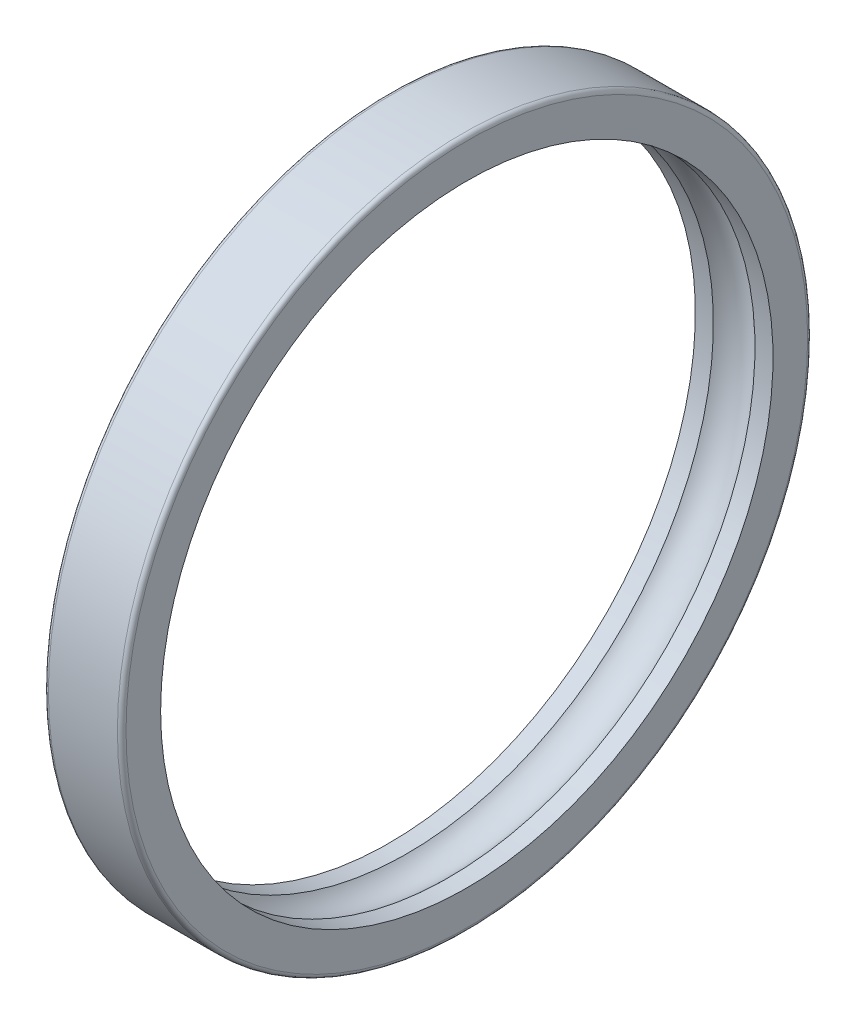
ISO-10303-21;
HEADER;
FILE_DESCRIPTION(('STEP AP214'),'2;1');
FILE_NAME('part.step','',(''),(''),'','','');
FILE_SCHEMA(('AUTOMOTIVE_DESIGN { 1 0 10303 214 1 1 1 1 }'));
ENDSEC;
DATA;
#1=APPLICATION_CONTEXT('core data for automotive mechanical design processes');
#2=APPLICATION_PROTOCOL_DEFINITION('international standard','automotive_design',2000,#1);
#3=PRODUCT_CONTEXT('',#1,'mechanical');
#4=PRODUCT('Part','Part','',(#3));
#5=PRODUCT_RELATED_PRODUCT_CATEGORY('part','',(#4));
#6=PRODUCT_DEFINITION_FORMATION('','',#4);
#7=PRODUCT_DEFINITION_CONTEXT('part definition',#1,'design');
#8=PRODUCT_DEFINITION('design','',#6,#7);
#9=PRODUCT_DEFINITION_SHAPE('','',#8);
#10=(LENGTH_UNIT() NAMED_UNIT(*) SI_UNIT(.MILLI.,.METRE.));
#11=(NAMED_UNIT(*) PLANE_ANGLE_UNIT() SI_UNIT($,.RADIAN.));
#12=(NAMED_UNIT(*) SI_UNIT($,.STERADIAN.) SOLID_ANGLE_UNIT());
#13=UNCERTAINTY_MEASURE_WITH_UNIT(LENGTH_MEASURE(1.E-05),#10,'distance_accuracy_value','');
#14=(GEOMETRIC_REPRESENTATION_CONTEXT(3) GLOBAL_UNCERTAINTY_ASSIGNED_CONTEXT((#13)) GLOBAL_UNIT_ASSIGNED_CONTEXT((#10,
#11,#12)) REPRESENTATION_CONTEXT('',''));
#15=CARTESIAN_POINT('',(0.,0.,0.));
#16=DIRECTION('',(0.,0.,1.));
#17=DIRECTION('',(1.,0.,0.));
#18=AXIS2_PLACEMENT_3D('',#15,#16,#17);
#19=CARTESIAN_POINT('',(0.99999999999922,0.,0.));
#20=DIRECTION('',(-1.,0.,0.));
#21=DIRECTION('',(0.,0.,1.));
#22=AXIS2_PLACEMENT_3D('',#19,#20,#21);
#23=TOROIDAL_SURFACE('',#22,79.0000000000008,0.999999999999222);
#24=CARTESIAN_POINT('',(0.,0.,0.));
#25=DIRECTION('',(-1.,0.,0.));
#26=DIRECTION('',(0.,0.,1.));
#27=AXIS2_PLACEMENT_3D('',#24,#25,#26);
#28=CIRCLE('',#27,79.);
#29=CARTESIAN_POINT('',(0.,0.,79.));
#30=VERTEX_POINT('',#29);
#31=EDGE_CURVE('E10',#30,#30,#28,.T.);
#32=ORIENTED_EDGE('',*,*,#31,.F.);
#33=EDGE_LOOP('',(#32));
#34=FACE_BOUND('',#33,.T.);
#35=CARTESIAN_POINT('',(1.,0.,0.));
#36=DIRECTION('',(-1.,0.,0.));
#37=DIRECTION('',(0.,0.,1.));
#38=AXIS2_PLACEMENT_3D('',#35,#36,#37);
#39=CIRCLE('',#38,80.);
#40=CARTESIAN_POINT('',(1.,0.,80.));
#41=VERTEX_POINT('',#40);
#42=EDGE_CURVE('E59',#41,#41,#39,.T.);
#43=ORIENTED_EDGE('',*,*,#42,.T.);
#44=EDGE_LOOP('',(#43));
#45=FACE_BOUND('',#44,.T.);
#46=ADVANCED_FACE('F31',(#34,#45),#23,.T.);
#47=CARTESIAN_POINT('',(0.,79.,0.));
#48=DIRECTION('',(1.,0.,0.));
#49=DIRECTION('',(0.,0.,-1.));
#50=AXIS2_PLACEMENT_3D('',#47,#48,#49);
#51=PLANE('',#50);
#52=CARTESIAN_POINT('',(0.,0.,0.));
#53=DIRECTION('',(-1.,0.,0.));
#54=DIRECTION('',(0.,0.,1.));
#55=AXIS2_PLACEMENT_3D('',#52,#53,#54);
#56=CIRCLE('',#55,70.975);
#57=CARTESIAN_POINT('',(0.,0.,70.975));
#58=VERTEX_POINT('',#57);
#59=EDGE_CURVE('E37',#58,#58,#56,.T.);
#60=ORIENTED_EDGE('',*,*,#59,.F.);
#61=EDGE_LOOP('',(#60));
#62=FACE_BOUND('',#61,.T.);
#63=ORIENTED_EDGE('',*,*,#31,.T.);
#64=EDGE_LOOP('',(#63));
#65=FACE_BOUND('',#64,.T.);
#66=ADVANCED_FACE('F96',(#62,#65),#51,.F.);
#67=CARTESIAN_POINT('',(200.,0.,0.));
#68=DIRECTION('',(-1.,0.,0.));
#69=DIRECTION('',(0.,0.,1.));
#70=AXIS2_PLACEMENT_3D('',#67,#68,#69);
#71=CYLINDRICAL_SURFACE('',#70,70.975);
#72=CARTESIAN_POINT('',(4.18373754867951,0.,0.));
#73=DIRECTION('',(-1.,0.,0.));
#74=DIRECTION('',(0.,0.,1.));
#75=AXIS2_PLACEMENT_3D('',#72,#73,#74);
#76=CIRCLE('',#75,70.975);
#77=CARTESIAN_POINT('',(4.18373754867951,0.,70.975));
#78=VERTEX_POINT('',#77);
#79=EDGE_CURVE('E41',#78,#78,#76,.T.);
#80=ORIENTED_EDGE('',*,*,#79,.F.);
#81=EDGE_LOOP('',(#80));
#82=FACE_BOUND('',#81,.T.);
#83=ORIENTED_EDGE('',*,*,#59,.T.);
#84=EDGE_LOOP('',(#83));
#85=FACE_BOUND('',#84,.T.);
#86=ADVANCED_FACE('F91',(#82,#85),#71,.F.);
#87=CARTESIAN_POINT('',(9.00000000000025,0.,0.));
#88=DIRECTION('',(-1.,0.,0.));
#89=DIRECTION('',(0.,0.,1.));
#90=AXIS2_PLACEMENT_3D('',#87,#88,#89);
#91=TOROIDAL_SURFACE('',#90,66.2499999999995,6.74700000000052);
#92=CARTESIAN_POINT('',(13.816262451321,0.,0.));
#93=DIRECTION('',(-1.,0.,0.));
#94=DIRECTION('',(0.,0.,1.));
#95=AXIS2_PLACEMENT_3D('',#92,#93,#94);
#96=CIRCLE('',#95,70.975);
#97=CARTESIAN_POINT('',(13.816262451321,0.,70.975));
#98=VERTEX_POINT('',#97);
#99=EDGE_CURVE('E45',#98,#98,#96,.T.);
#100=ORIENTED_EDGE('',*,*,#99,.F.);
#101=EDGE_LOOP('',(#100));
#102=FACE_BOUND('',#101,.T.);
#103=ORIENTED_EDGE('',*,*,#79,.T.);
#104=EDGE_LOOP('',(#103));
#105=FACE_BOUND('',#104,.T.);
#106=ADVANCED_FACE('F85',(#102,#105),#91,.F.);
#107=CARTESIAN_POINT('',(200.,0.,0.));
#108=DIRECTION('',(-1.,0.,0.));
#109=DIRECTION('',(0.,0.,1.));
#110=AXIS2_PLACEMENT_3D('',#107,#108,#109);
#111=CYLINDRICAL_SURFACE('',#110,70.975);
#112=CARTESIAN_POINT('',(18.,0.,0.));
#113=DIRECTION('',(-1.,0.,0.));
#114=DIRECTION('',(0.,0.,1.));
#115=AXIS2_PLACEMENT_3D('',#112,#113,#114);
#116=CIRCLE('',#115,70.975);
#117=CARTESIAN_POINT('',(18.,0.,70.975));
#118=VERTEX_POINT('',#117);
#119=EDGE_CURVE('E50',#118,#118,#116,.T.);
#120=ORIENTED_EDGE('',*,*,#119,.F.);
#121=EDGE_LOOP('',(#120));
#122=FACE_BOUND('',#121,.T.);
#123=ORIENTED_EDGE('',*,*,#99,.T.);
#124=EDGE_LOOP('',(#123));
#125=FACE_BOUND('',#124,.T.);
#126=ADVANCED_FACE('F79',(#122,#125),#111,.F.);
#127=CARTESIAN_POINT('',(18.,70.975,0.));
#128=DIRECTION('',(-1.,0.,0.));
#129=DIRECTION('',(0.,0.,1.));
#130=AXIS2_PLACEMENT_3D('',#127,#128,#129);
#131=PLANE('',#130);
#132=CARTESIAN_POINT('',(18.,0.,0.));
#133=DIRECTION('',(-1.,0.,0.));
#134=DIRECTION('',(0.,0.,1.));
#135=AXIS2_PLACEMENT_3D('',#132,#133,#134);
#136=CIRCLE('',#135,79.);
#137=CARTESIAN_POINT('',(18.,0.,79.));
#138=VERTEX_POINT('',#137);
#139=EDGE_CURVE('E53',#138,#138,#136,.T.);
#140=ORIENTED_EDGE('',*,*,#139,.F.);
#141=EDGE_LOOP('',(#140));
#142=FACE_BOUND('',#141,.T.);
#143=ORIENTED_EDGE('',*,*,#119,.T.);
#144=EDGE_LOOP('',(#143));
#145=FACE_BOUND('',#144,.T.);
#146=ADVANCED_FACE('F73',(#142,#145),#131,.F.);
#147=CARTESIAN_POINT('',(17.0000000000016,0.,0.));
#148=DIRECTION('',(-1.,0.,0.));
#149=DIRECTION('',(0.,0.,1.));
#150=AXIS2_PLACEMENT_3D('',#147,#148,#149);
#151=TOROIDAL_SURFACE('',#150,79.0000000000015,0.999999999998453);
#152=CARTESIAN_POINT('',(17.,0.,0.));
#153=DIRECTION('',(-1.,0.,0.));
#154=DIRECTION('',(0.,0.,1.));
#155=AXIS2_PLACEMENT_3D('',#152,#153,#154);
#156=CIRCLE('',#155,80.);
#157=CARTESIAN_POINT('',(17.,0.,80.));
#158=VERTEX_POINT('',#157);
#159=EDGE_CURVE('E56',#158,#158,#156,.T.);
#160=ORIENTED_EDGE('',*,*,#159,.F.);
#161=EDGE_LOOP('',(#160));
#162=FACE_BOUND('',#161,.T.);
#163=ORIENTED_EDGE('',*,*,#139,.T.);
#164=EDGE_LOOP('',(#163));
#165=FACE_BOUND('',#164,.T.);
#166=ADVANCED_FACE('F67',(#162,#165),#151,.T.);
#167=CARTESIAN_POINT('',(200.,0.,0.));
#168=DIRECTION('',(-1.,0.,0.));
#169=DIRECTION('',(0.,0.,1.));
#170=AXIS2_PLACEMENT_3D('',#167,#168,#169);
#171=CYLINDRICAL_SURFACE('',#170,80.);
#172=ORIENTED_EDGE('',*,*,#42,.F.);
#173=EDGE_LOOP('',(#172));
#174=FACE_BOUND('',#173,.T.);
#175=ORIENTED_EDGE('',*,*,#159,.T.);
#176=EDGE_LOOP('',(#175));
#177=FACE_BOUND('',#176,.T.);
#178=ADVANCED_FACE('F64',(#174,#177),#171,.T.);
#179=CLOSED_SHELL('',(#46,#66,#86,#106,#126,#146,#166,#178));
#180=MANIFOLD_SOLID_BREP('B2',#179);
#181=ADVANCED_BREP_SHAPE_REPRESENTATION('',(#18,#180),#14);
#182=SHAPE_DEFINITION_REPRESENTATION(#9,#181);
ENDSEC;
END-ISO-10303-21;
